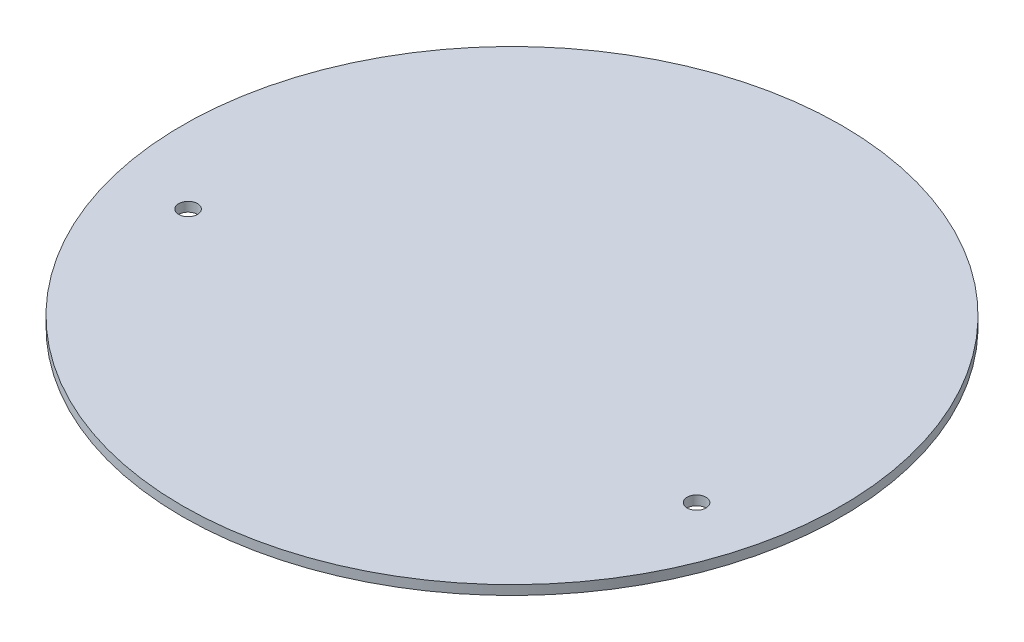
ISO-10303-21;
HEADER;
FILE_DESCRIPTION(('STEP AP214'),'2;1');
FILE_NAME('part.step','',(''),(''),'','','');
FILE_SCHEMA(('AUTOMOTIVE_DESIGN { 1 0 10303 214 1 1 1 1 }'));
ENDSEC;
DATA;
#1=APPLICATION_CONTEXT('core data for automotive mechanical design processes');
#2=APPLICATION_PROTOCOL_DEFINITION('international standard','automotive_design',2000,#1);
#3=PRODUCT_CONTEXT('',#1,'mechanical');
#4=PRODUCT('Part','Part','',(#3));
#5=PRODUCT_RELATED_PRODUCT_CATEGORY('part','',(#4));
#6=PRODUCT_DEFINITION_FORMATION('','',#4);
#7=PRODUCT_DEFINITION_CONTEXT('part definition',#1,'design');
#8=PRODUCT_DEFINITION('design','',#6,#7);
#9=PRODUCT_DEFINITION_SHAPE('','',#8);
#10=(LENGTH_UNIT() NAMED_UNIT(*) SI_UNIT(.MILLI.,.METRE.));
#11=(NAMED_UNIT(*) PLANE_ANGLE_UNIT() SI_UNIT($,.RADIAN.));
#12=(NAMED_UNIT(*) SI_UNIT($,.STERADIAN.) SOLID_ANGLE_UNIT());
#13=UNCERTAINTY_MEASURE_WITH_UNIT(LENGTH_MEASURE(1.E-05),#10,'distance_accuracy_value','');
#14=(GEOMETRIC_REPRESENTATION_CONTEXT(3) GLOBAL_UNCERTAINTY_ASSIGNED_CONTEXT((#13)) GLOBAL_UNIT_ASSIGNED_CONTEXT((#10,
#11,#12)) REPRESENTATION_CONTEXT('',''));
#15=CARTESIAN_POINT('',(0.,0.,0.));
#16=DIRECTION('',(0.,0.,1.));
#17=DIRECTION('',(1.,0.,0.));
#18=AXIS2_PLACEMENT_3D('',#15,#16,#17);
#19=CARTESIAN_POINT('',(0.,0.5,0.));
#20=DIRECTION('',(0.,1.,0.));
#21=DIRECTION('',(0.,0.,1.));
#22=AXIS2_PLACEMENT_3D('',#19,#20,#21);
#23=PLANE('',#22);
#24=CARTESIAN_POINT('',(-27.,0.5,7.4));
#25=DIRECTION('',(0.,1.,0.));
#26=DIRECTION('',(0.,0.,1.));
#27=AXIS2_PLACEMENT_3D('',#24,#25,#26);
#28=CIRCLE('',#27,1.);
#29=CARTESIAN_POINT('',(-27.,0.5,8.4));
#30=VERTEX_POINT('',#29);
#31=EDGE_CURVE('E54',#30,#30,#28,.T.);
#32=ORIENTED_EDGE('',*,*,#31,.F.);
#33=EDGE_LOOP('',(#32));
#34=FACE_BOUND('',#33,.T.);
#35=CARTESIAN_POINT('',(0.,0.5,0.));
#36=DIRECTION('',(0.,1.,0.));
#37=DIRECTION('',(0.,0.,1.));
#38=AXIS2_PLACEMENT_3D('',#35,#36,#37);
#39=CIRCLE('',#38,35.);
#40=CARTESIAN_POINT('',(0.,0.5,35.));
#41=VERTEX_POINT('',#40);
#42=EDGE_CURVE('E10',#41,#41,#39,.T.);
#43=ORIENTED_EDGE('',*,*,#42,.T.);
#44=EDGE_LOOP('',(#43));
#45=FACE_BOUND('',#44,.T.);
#46=CARTESIAN_POINT('',(27.,0.5,7.4));
#47=DIRECTION('',(0.,1.,0.));
#48=DIRECTION('',(0.,0.,1.));
#49=AXIS2_PLACEMENT_3D('',#46,#47,#48);
#50=CIRCLE('',#49,1.);
#51=CARTESIAN_POINT('',(27.,0.5,8.4));
#52=VERTEX_POINT('',#51);
#53=EDGE_CURVE('E60',#52,#52,#50,.T.);
#54=ORIENTED_EDGE('',*,*,#53,.F.);
#55=EDGE_LOOP('',(#54));
#56=FACE_BOUND('',#55,.T.);
#57=ADVANCED_FACE('F41',(#34,#45,#56),#23,.T.);
#58=CARTESIAN_POINT('',(0.,-0.5,0.));
#59=DIRECTION('',(0.,1.,0.));
#60=DIRECTION('',(0.,0.,1.));
#61=AXIS2_PLACEMENT_3D('',#58,#59,#60);
#62=PLANE('',#61);
#63=CARTESIAN_POINT('',(0.,-0.5,0.));
#64=DIRECTION('',(0.,1.,0.));
#65=DIRECTION('',(0.,0.,1.));
#66=AXIS2_PLACEMENT_3D('',#63,#64,#65);
#67=CIRCLE('',#66,35.);
#68=CARTESIAN_POINT('',(0.,-0.5,35.));
#69=VERTEX_POINT('',#68);
#70=EDGE_CURVE('E45',#69,#69,#67,.T.);
#71=ORIENTED_EDGE('',*,*,#70,.F.);
#72=EDGE_LOOP('',(#71));
#73=FACE_BOUND('',#72,.T.);
#74=CARTESIAN_POINT('',(-27.,-0.5,7.4));
#75=DIRECTION('',(0.,1.,0.));
#76=DIRECTION('',(0.,0.,1.));
#77=AXIS2_PLACEMENT_3D('',#74,#75,#76);
#78=CIRCLE('',#77,1.);
#79=CARTESIAN_POINT('',(-27.,-0.5,8.4));
#80=VERTEX_POINT('',#79);
#81=EDGE_CURVE('E56',#80,#80,#78,.T.);
#82=ORIENTED_EDGE('',*,*,#81,.T.);
#83=EDGE_LOOP('',(#82));
#84=FACE_BOUND('',#83,.T.);
#85=CARTESIAN_POINT('',(27.,-0.5,7.4));
#86=DIRECTION('',(0.,1.,0.));
#87=DIRECTION('',(0.,0.,1.));
#88=AXIS2_PLACEMENT_3D('',#85,#86,#87);
#89=CIRCLE('',#88,1.);
#90=CARTESIAN_POINT('',(27.,-0.5,8.4));
#91=VERTEX_POINT('',#90);
#92=EDGE_CURVE('E64',#91,#91,#89,.T.);
#93=ORIENTED_EDGE('',*,*,#92,.T.);
#94=EDGE_LOOP('',(#93));
#95=FACE_BOUND('',#94,.T.);
#96=ADVANCED_FACE('F76',(#73,#84,#95),#62,.F.);
#97=CARTESIAN_POINT('',(0.,0.5,0.));
#98=DIRECTION('',(0.,-1.,0.));
#99=DIRECTION('',(0.,0.,-1.));
#100=AXIS2_PLACEMENT_3D('',#97,#98,#99);
#101=CYLINDRICAL_SURFACE('',#100,35.);
#102=ORIENTED_EDGE('',*,*,#42,.F.);
#103=EDGE_LOOP('',(#102));
#104=FACE_BOUND('',#103,.T.);
#105=ORIENTED_EDGE('',*,*,#70,.T.);
#106=EDGE_LOOP('',(#105));
#107=FACE_BOUND('',#106,.T.);
#108=ADVANCED_FACE('F43',(#104,#107),#101,.T.);
#109=CARTESIAN_POINT('',(-27.,0.5,7.4));
#110=DIRECTION('',(0.,-1.,0.));
#111=DIRECTION('',(0.,0.,-1.));
#112=AXIS2_PLACEMENT_3D('',#109,#110,#111);
#113=CYLINDRICAL_SURFACE('',#112,1.);
#114=ORIENTED_EDGE('',*,*,#31,.T.);
#115=EDGE_LOOP('',(#114));
#116=FACE_BOUND('',#115,.T.);
#117=ORIENTED_EDGE('',*,*,#81,.F.);
#118=EDGE_LOOP('',(#117));
#119=FACE_BOUND('',#118,.T.);
#120=ADVANCED_FACE('F85',(#116,#119),#113,.F.);
#121=CARTESIAN_POINT('',(27.,0.5,7.4));
#122=DIRECTION('',(0.,-1.,0.));
#123=DIRECTION('',(0.,0.,-1.));
#124=AXIS2_PLACEMENT_3D('',#121,#122,#123);
#125=CYLINDRICAL_SURFACE('',#124,1.);
#126=ORIENTED_EDGE('',*,*,#53,.T.);
#127=EDGE_LOOP('',(#126));
#128=FACE_BOUND('',#127,.T.);
#129=ORIENTED_EDGE('',*,*,#92,.F.);
#130=EDGE_LOOP('',(#129));
#131=FACE_BOUND('',#130,.T.);
#132=ADVANCED_FACE('F72',(#128,#131),#125,.F.);
#133=CLOSED_SHELL('',(#57,#96,#108,#120,#132));
#134=MANIFOLD_SOLID_BREP('B2',#133);
#135=ADVANCED_BREP_SHAPE_REPRESENTATION('',(#18,#134),#14);
#136=SHAPE_DEFINITION_REPRESENTATION(#9,#135);
ENDSEC;
END-ISO-10303-21;
